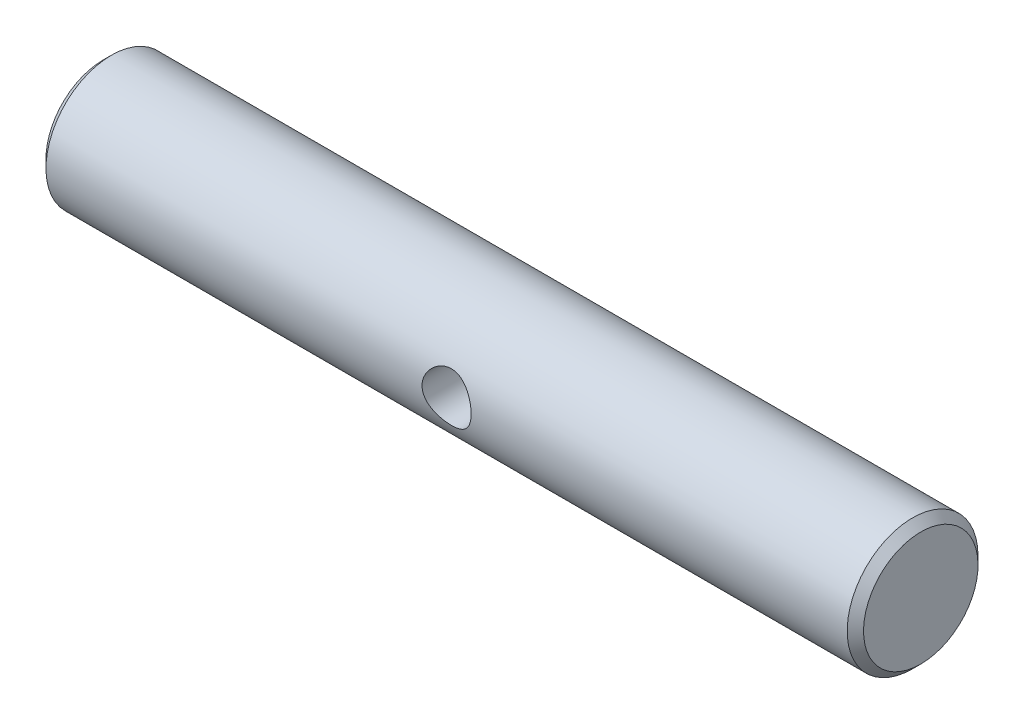
ISO-10303-21;
HEADER;
FILE_DESCRIPTION(('STEP AP214'),'2;1');
FILE_NAME('part.step','',(''),(''),'','','');
FILE_SCHEMA(('AUTOMOTIVE_DESIGN { 1 0 10303 214 1 1 1 1 }'));
ENDSEC;
DATA;
#1=APPLICATION_CONTEXT('core data for automotive mechanical design processes');
#2=APPLICATION_PROTOCOL_DEFINITION('international standard','automotive_design',2000,#1);
#3=PRODUCT_CONTEXT('',#1,'mechanical');
#4=PRODUCT('Part','Part','',(#3));
#5=PRODUCT_RELATED_PRODUCT_CATEGORY('part','',(#4));
#6=PRODUCT_DEFINITION_FORMATION('','',#4);
#7=PRODUCT_DEFINITION_CONTEXT('part definition',#1,'design');
#8=PRODUCT_DEFINITION('design','',#6,#7);
#9=PRODUCT_DEFINITION_SHAPE('','',#8);
#10=(LENGTH_UNIT() NAMED_UNIT(*) SI_UNIT(.MILLI.,.METRE.));
#11=(NAMED_UNIT(*) PLANE_ANGLE_UNIT() SI_UNIT($,.RADIAN.));
#12=(NAMED_UNIT(*) SI_UNIT($,.STERADIAN.) SOLID_ANGLE_UNIT());
#13=UNCERTAINTY_MEASURE_WITH_UNIT(LENGTH_MEASURE(1.E-05),#10,'distance_accuracy_value','');
#14=(GEOMETRIC_REPRESENTATION_CONTEXT(3) GLOBAL_UNCERTAINTY_ASSIGNED_CONTEXT((#13)) GLOBAL_UNIT_ASSIGNED_CONTEXT((#10,
#11,#12)) REPRESENTATION_CONTEXT('',''));
#15=CARTESIAN_POINT('',(0.,0.,0.));
#16=DIRECTION('',(0.,0.,1.));
#17=DIRECTION('',(1.,0.,0.));
#18=AXIS2_PLACEMENT_3D('',#15,#16,#17);
#19=CARTESIAN_POINT('',(-25.,0.,0.));
#20=DIRECTION('',(1.,0.,0.));
#21=DIRECTION('',(0.,0.,-1.));
#22=AXIS2_PLACEMENT_3D('',#19,#20,#21);
#23=PLANE('',#22);
#24=CARTESIAN_POINT('',(-24.9999999999204,0.,15.));
#25=DIRECTION('',(1.,0.,0.));
#26=DIRECTION('',(0.,1.,0.));
#27=AXIS2_PLACEMENT_3D('',#24,#25,#26);
#28=CIRCLE('',#27,3.49999999998772);
#29=CARTESIAN_POINT('',(-24.9999999999204,3.49999999998772,15.));
#30=VERTEX_POINT('',#29);
#31=EDGE_CURVE('E18',#30,#30,#28,.T.);
#32=ORIENTED_EDGE('',*,*,#31,.F.);
#33=EDGE_LOOP('',(#32));
#34=FACE_BOUND('',#33,.T.);
#35=ADVANCED_FACE('F15',(#34),#23,.F.);
#36=CARTESIAN_POINT('',(25.,0.,0.));
#37=DIRECTION('',(1.,0.,0.));
#38=DIRECTION('',(0.,0.,-1.));
#39=AXIS2_PLACEMENT_3D('',#36,#37,#38);
#40=PLANE('',#39);
#41=CARTESIAN_POINT('',(25.0000000000341,0.,15.));
#42=DIRECTION('',(-1.,0.,0.));
#43=DIRECTION('',(0.,-1.,0.));
#44=AXIS2_PLACEMENT_3D('',#41,#42,#43);
#45=CIRCLE('',#44,3.49999999996044);
#46=CARTESIAN_POINT('',(25.0000000000341,-3.49999999996044,15.));
#47=VERTEX_POINT('',#46);
#48=EDGE_CURVE('E79',#47,#47,#45,.T.);
#49=ORIENTED_EDGE('',*,*,#48,.F.);
#50=EDGE_LOOP('',(#49));
#51=FACE_BOUND('',#50,.T.);
#52=ADVANCED_FACE('F68',(#51),#40,.T.);
#53=CARTESIAN_POINT('',(-24.4999999999322,0.,15.));
#54=DIRECTION('',(1.,0.,0.));
#55=DIRECTION('',(0.,1.,0.));
#56=AXIS2_PLACEMENT_3D('',#53,#54,#55);
#57=CONICAL_SURFACE('',#56,3.9999999999759,0.785398163397448);
#58=ORIENTED_EDGE('',*,*,#31,.T.);
#59=EDGE_LOOP('',(#58));
#60=FACE_BOUND('',#59,.T.);
#61=CARTESIAN_POINT('',(-24.5,0.,15.));
#62=DIRECTION('',(1.,0.,0.));
#63=DIRECTION('',(0.,0.,-1.));
#64=AXIS2_PLACEMENT_3D('',#61,#62,#63);
#65=CIRCLE('',#64,4.);
#66=CARTESIAN_POINT('',(-24.5,0.,11.));
#67=VERTEX_POINT('',#66);
#68=EDGE_CURVE('E36',#67,#67,#65,.T.);
#69=ORIENTED_EDGE('',*,*,#68,.F.);
#70=EDGE_LOOP('',(#69));
#71=FACE_BOUND('',#70,.T.);
#72=ADVANCED_FACE('F63',(#60,#71),#57,.T.);
#73=CARTESIAN_POINT('',(24.5000000001028,0.,15.));
#74=DIRECTION('',(-1.,0.,0.));
#75=DIRECTION('',(0.,-1.,0.));
#76=AXIS2_PLACEMENT_3D('',#73,#74,#75);
#77=CONICAL_SURFACE('',#76,3.99999999989177,0.785398163397448);
#78=ORIENTED_EDGE('',*,*,#48,.T.);
#79=EDGE_LOOP('',(#78));
#80=FACE_BOUND('',#79,.T.);
#81=CARTESIAN_POINT('',(24.5,0.,15.));
#82=DIRECTION('',(1.,0.,0.));
#83=DIRECTION('',(0.,0.,-1.));
#84=AXIS2_PLACEMENT_3D('',#81,#82,#83);
#85=CIRCLE('',#84,4.);
#86=CARTESIAN_POINT('',(24.5,0.,11.));
#87=VERTEX_POINT('',#86);
#88=EDGE_CURVE('E22',#87,#87,#85,.F.);
#89=ORIENTED_EDGE('',*,*,#88,.F.);
#90=EDGE_LOOP('',(#89));
#91=FACE_BOUND('',#90,.T.);
#92=ADVANCED_FACE('F52',(#80,#91),#77,.T.);
#93=CARTESIAN_POINT('',(0.,0.,-28.5269119345812));
#94=DIRECTION('',(0.,0.,1.));
#95=DIRECTION('',(1.,0.,0.));
#96=AXIS2_PLACEMENT_3D('',#93,#94,#95);
#97=CYLINDRICAL_SURFACE('',#96,1.5);
#98=CARTESIAN_POINT('',(1.5,0.,19.));
#99=CARTESIAN_POINT('',(1.49999531099465,-0.081111642988471,18.9999964151412));
#100=CARTESIAN_POINT('',(1.49338938745138,-0.16229921963897,18.9975065011371));
#101=CARTESIAN_POINT('',(1.46720660039424,-0.322336155858778,18.987800545205));
#102=CARTESIAN_POINT('',(1.44760993379607,-0.401181753294325,18.9805772879636));
#103=CARTESIAN_POINT('',(1.39624231347491,-0.554069232231289,18.9621864368416));
#104=CARTESIAN_POINT('',(1.36450309579201,-0.628123052651569,18.9510291309837));
#105=CARTESIAN_POINT('',(1.2898799190623,-0.76982215727645,18.9258832837471));
#106=CARTESIAN_POINT('',(1.24699654962911,-0.837467780266993,18.9118948921638));
#107=CARTESIAN_POINT('',(1.14938858838142,-0.96734457210255,18.8818627952405));
#108=CARTESIAN_POINT('',(1.09427228489637,-1.02926777687364,18.865760764713));
#109=CARTESIAN_POINT('',(0.974592564626967,-1.14324188632408,18.8336029601821));
#110=CARTESIAN_POINT('',(0.910025832054865,-1.19528931119753,18.8175472044392));
#111=CARTESIAN_POINT('',(0.770282478567811,-1.28998203402363,18.7866246925215));
#112=CARTESIAN_POINT('',(0.694795528037964,-1.33219398439963,18.7718264670517));
#113=CARTESIAN_POINT('',(0.537151533998551,-1.40318650874601,18.7459985878248));
#114=CARTESIAN_POINT('',(0.454997179300717,-1.43197246582411,18.7349674241526));
#115=CARTESIAN_POINT('',(0.289883223820329,-1.4740843178649,18.7185441245557));
#116=CARTESIAN_POINT('',(0.207094888296945,-1.48799594439153,18.7129392385568));
#117=CARTESIAN_POINT('',(0.0401837675610272,-1.50179556532977,18.7073806146396));
#118=CARTESIAN_POINT('',(-0.0439384509453212,-1.50168936368421,18.7074245378876));
#119=CARTESIAN_POINT('',(-0.205769379258228,-1.48790430964632,18.7129751112928));
#120=CARTESIAN_POINT('',(-0.283560616182979,-1.47503813739896,18.7181546693363));
#121=CARTESIAN_POINT('',(-0.435786872782353,-1.43744176653922,18.7328493450566));
#122=CARTESIAN_POINT('',(-0.510221372622172,-1.4127097371985,18.7423651317386));
#123=CARTESIAN_POINT('',(-0.655278746807224,-1.35163679493086,18.764857282738));
#124=CARTESIAN_POINT('',(-0.725802721117845,-1.31508487135367,18.7778957798673));
#125=CARTESIAN_POINT('',(-0.859948672521441,-1.23155851162953,18.8059427916407));
#126=CARTESIAN_POINT('',(-0.923568573944547,-1.18458095393025,18.8209518957561));
#127=CARTESIAN_POINT('',(-1.04659388295345,-1.07782653131746,18.8524778893326));
#128=CARTESIAN_POINT('',(-1.10543046100101,-1.01740255191559,18.8690283901562));
#129=CARTESIAN_POINT('',(-1.21232323409957,-0.887333075094534,18.9009125484397));
#130=CARTESIAN_POINT('',(-1.26037445221371,-0.817683343900649,18.9162456420228));
#131=CARTESIAN_POINT('',(-1.34496404362537,-0.669667722666034,18.9442752164331));
#132=CARTESIAN_POINT('',(-1.38130440400476,-0.591179456886812,18.9569252251831));
#133=CARTESIAN_POINT('',(-1.44001960464153,-0.428688642380452,18.977800303447));
#134=CARTESIAN_POINT('',(-1.46242269657434,-0.344697632799011,18.9860343197348));
#135=CARTESIAN_POINT('',(-1.48491866803032,-0.216582758497681,18.9943639258091));
#136=CARTESIAN_POINT('',(-1.49056593106552,-0.173494852533975,18.9964702826107));
#137=CARTESIAN_POINT('',(-1.49810784826254,-0.086945238012849,18.9992892785148));
#138=CARTESIAN_POINT('',(-1.50000251375142,-0.0434835305841308,19.0000019218242));
#139=CARTESIAN_POINT('',(-1.49999531099465,0.0811116429884713,18.9999964151412));
#140=CARTESIAN_POINT('',(-1.49338938745138,0.16229921963897,18.9975065011371));
#141=CARTESIAN_POINT('',(-1.46720660039424,0.322336155858779,18.987800545205));
#142=CARTESIAN_POINT('',(-1.44760993379607,0.401181753294325,18.9805772879636));
#143=CARTESIAN_POINT('',(-1.39624231347491,0.554069232231289,18.9621864368416));
#144=CARTESIAN_POINT('',(-1.36450309579201,0.628123052651569,18.9510291309837));
#145=CARTESIAN_POINT('',(-1.2898799190623,0.76982215727645,18.9258832837471));
#146=CARTESIAN_POINT('',(-1.24699654962911,0.837467780266993,18.9118948921638));
#147=CARTESIAN_POINT('',(-1.14938858838142,0.96734457210255,18.8818627952405));
#148=CARTESIAN_POINT('',(-1.09427228489637,1.02926777687364,18.865760764713));
#149=CARTESIAN_POINT('',(-0.974592564626967,1.14324188632408,18.8336029601821));
#150=CARTESIAN_POINT('',(-0.910025832054865,1.19528931119753,18.8175472044392));
#151=CARTESIAN_POINT('',(-0.770282478567812,1.28998203402363,18.7866246925215));
#152=CARTESIAN_POINT('',(-0.694795528037965,1.33219398439963,18.7718264670517));
#153=CARTESIAN_POINT('',(-0.537151533998552,1.40318650874601,18.7459985878248));
#154=CARTESIAN_POINT('',(-0.454997179300718,1.43197246582411,18.7349674241526));
#155=CARTESIAN_POINT('',(-0.289883223820329,1.4740843178649,18.7185441245557));
#156=CARTESIAN_POINT('',(-0.207094888296945,1.48799594439153,18.7129392385568));
#157=CARTESIAN_POINT('',(-0.0401837675610266,1.50179556532977,18.7073806146396));
#158=CARTESIAN_POINT('',(0.0439384509453218,1.50168936368421,18.7074245378876));
#159=CARTESIAN_POINT('',(0.205769379258228,1.48790430964632,18.7129751112928));
#160=CARTESIAN_POINT('',(0.283560616182979,1.47503813739896,18.7181546693363));
#161=CARTESIAN_POINT('',(0.435786872782354,1.43744176653922,18.7328493450565));
#162=CARTESIAN_POINT('',(0.510221372622173,1.4127097371985,18.7423651317386));
#163=CARTESIAN_POINT('',(0.655278746807224,1.35163679493086,18.764857282738));
#164=CARTESIAN_POINT('',(0.725802721117845,1.31508487135368,18.7778957798673));
#165=CARTESIAN_POINT('',(0.85994867252144,1.23155851162953,18.8059427916407));
#166=CARTESIAN_POINT('',(0.923568573944546,1.18458095393025,18.8209518957561));
#167=CARTESIAN_POINT('',(1.04659388295345,1.07782653131746,18.8524778893326));
#168=CARTESIAN_POINT('',(1.10543046100101,1.01740255191559,18.8690283901562));
#169=CARTESIAN_POINT('',(1.21232323409957,0.887333075094535,18.9009125484397));
#170=CARTESIAN_POINT('',(1.26037445221371,0.817683343900649,18.9162456420228));
#171=CARTESIAN_POINT('',(1.34496404362537,0.669667722666033,18.9442752164331));
#172=CARTESIAN_POINT('',(1.38130440400476,0.591179456886811,18.9569252251831));
#173=CARTESIAN_POINT('',(1.44001960464153,0.428688642380452,18.977800303447));
#174=CARTESIAN_POINT('',(1.46242269657434,0.344697632799011,18.9860343197348));
#175=CARTESIAN_POINT('',(1.48491866803032,0.216582758497681,18.9943639258091));
#176=CARTESIAN_POINT('',(1.49056593106552,0.173494852533975,18.9964702826107));
#177=CARTESIAN_POINT('',(1.49810784826254,0.0869452380128492,18.9992892785148));
#178=CARTESIAN_POINT('',(1.50000251375142,0.0434835305841311,19.0000019218242));
#179=CARTESIAN_POINT('',(1.5,0.,19.));
#180=B_SPLINE_CURVE_WITH_KNOTS('',3,(#98,#99,#100,#101,#102,#103,#104,#105,#106,#107,#108,#109,
#110,#111,#112,#113,#114,#115,#116,#117,#118,#119,#120,#121,#122,#123,#124,#125,#126,#127,#128,
#129,#130,#131,#132,#133,#134,#135,#136,#137,#138,#139,#140,#141,#142,#143,#144,#145,#146,#147,
#148,#149,#150,#151,#152,#153,#154,#155,#156,#157,#158,#159,#160,#161,#162,#163,#164,#165,#166,
#167,#168,#169,#170,#171,#172,#173,#174,#175,#176,#177,#178,#179),.UNSPECIFIED.,.T.,.F.,(4,2,2,
2,2,2,2,2,2,2,2,2,2,2,2,2,2,2,2,2,2,2,2,2,2,2,2,2,2,2,2,2,2,2,2,2,2,2,2,2,4),(0.,
0.243166514302296,0.486704566599219,0.729610403544445,0.972503391468791,1.22473037141675,
1.47704606108122,1.73896693662271,2.00078270538428,2.25185886666104,2.50283107266743,
2.73878302477871,2.97477139254032,3.21522960902626,3.45575991877768,3.71242215551977,
3.96920258743901,4.23012113132895,4.49050903953852,4.62086973855367,4.75123004407976,
4.99439655838206,5.23793461067898,5.48084044762421,5.72373343554855,5.97596041549652,
6.22827610516098,6.49019698070247,6.75201274946405,7.0030889107408,7.25406111674719,
7.49001306885847,7.72600143662008,7.96645965310602,8.20698996285745,8.46365219959953,
8.72043263151877,8.98135117540872,9.24173908361828,9.37209978263343,9.50246008815952),.UNSPECIFIED.);
#181=CARTESIAN_POINT('',(1.5,0.,19.));
#182=VERTEX_POINT('',#181);
#183=EDGE_CURVE('E10',#182,#182,#180,.T.);
#184=ORIENTED_EDGE('',*,*,#183,.F.);
#185=EDGE_LOOP('',(#184));
#186=FACE_BOUND('',#185,.T.);
#187=CARTESIAN_POINT('',(-1.5,0.,11.));
#188=CARTESIAN_POINT('',(-1.49999531099465,-0.0811116429884721,11.0000035848588));
#189=CARTESIAN_POINT('',(-1.49338938745138,-0.162299219638971,11.0024934988629));
#190=CARTESIAN_POINT('',(-1.46720660039424,-0.32233615585878,11.012199454795));
#191=CARTESIAN_POINT('',(-1.44760993379607,-0.401181753294326,11.0194227120364));
#192=CARTESIAN_POINT('',(-1.39624231347491,-0.55406923223129,11.0378135631584));
#193=CARTESIAN_POINT('',(-1.36450309579201,-0.62812305265157,11.0489708690163));
#194=CARTESIAN_POINT('',(-1.2898799190623,-0.76982215727645,11.0741167162529));
#195=CARTESIAN_POINT('',(-1.2469965496291,-0.837467780266993,11.0881051078361));
#196=CARTESIAN_POINT('',(-1.14938858838142,-0.96734457210255,11.1181372047595));
#197=CARTESIAN_POINT('',(-1.09427228489637,-1.02926777687364,11.134239235287));
#198=CARTESIAN_POINT('',(-0.974592564626967,-1.14324188632408,11.1663970398179));
#199=CARTESIAN_POINT('',(-0.910025832054865,-1.19528931119753,11.1824527955608));
#200=CARTESIAN_POINT('',(-0.770282478567811,-1.28998203402363,11.2133753074785));
#201=CARTESIAN_POINT('',(-0.694795528037963,-1.33219398439963,11.2281735329483));
#202=CARTESIAN_POINT('',(-0.537151533998551,-1.40318650874601,11.2540014121752));
#203=CARTESIAN_POINT('',(-0.454997179300717,-1.43197246582411,11.2650325758474));
#204=CARTESIAN_POINT('',(-0.289883223820329,-1.4740843178649,11.2814558754443));
#205=CARTESIAN_POINT('',(-0.207094888296945,-1.48799594439153,11.2870607614432));
#206=CARTESIAN_POINT('',(-0.0401837675610272,-1.50179556532977,11.2926193853604));
#207=CARTESIAN_POINT('',(0.0439384509453212,-1.50168936368421,11.2925754621124));
#208=CARTESIAN_POINT('',(0.205769379258228,-1.48790430964632,11.2870248887072));
#209=CARTESIAN_POINT('',(0.283560616182979,-1.47503813739896,11.2818453306637));
#210=CARTESIAN_POINT('',(0.435786872782353,-1.43744176653922,11.2671506549435));
#211=CARTESIAN_POINT('',(0.510221372622172,-1.4127097371985,11.2576348682614));
#212=CARTESIAN_POINT('',(0.655278746807223,-1.35163679493086,11.235142717262));
#213=CARTESIAN_POINT('',(0.725802721117845,-1.31508487135368,11.2221042201327));
#214=CARTESIAN_POINT('',(0.85994867252144,-1.23155851162953,11.1940572083593));
#215=CARTESIAN_POINT('',(0.923568573944546,-1.18458095393025,11.1790481042439));
#216=CARTESIAN_POINT('',(1.04659388295345,-1.07782653131746,11.1475221106674));
#217=CARTESIAN_POINT('',(1.10543046100101,-1.01740255191559,11.1309716098437));
#218=CARTESIAN_POINT('',(1.21232323409957,-0.887333075094535,11.0990874515603));
#219=CARTESIAN_POINT('',(1.26037445221371,-0.817683343900649,11.0837543579772));
#220=CARTESIAN_POINT('',(1.34496404362537,-0.669667722666033,11.0557247835669));
#221=CARTESIAN_POINT('',(1.38130440400476,-0.591179456886811,11.0430747748169));
#222=CARTESIAN_POINT('',(1.44001960464153,-0.428688642380452,11.022199696553));
#223=CARTESIAN_POINT('',(1.46242269657435,-0.34469763279901,11.0139656802652));
#224=CARTESIAN_POINT('',(1.48491866803032,-0.216582758497681,11.0056360741909));
#225=CARTESIAN_POINT('',(1.49056593106552,-0.173494852533975,11.0035297173893));
#226=CARTESIAN_POINT('',(1.49810784826254,-0.0869452380128499,11.0007107214852));
#227=CARTESIAN_POINT('',(1.50000251375142,-0.043483530584132,10.9999980781758));
#228=CARTESIAN_POINT('',(1.49999531099465,0.0811116429884697,11.0000035848588));
#229=CARTESIAN_POINT('',(1.49338938745138,0.162299219638968,11.0024934988629));
#230=CARTESIAN_POINT('',(1.46720660039425,0.322336155858777,11.012199454795));
#231=CARTESIAN_POINT('',(1.44760993379608,0.401181753294324,11.0194227120364));
#232=CARTESIAN_POINT('',(1.39624231347491,0.554069232231287,11.0378135631584));
#233=CARTESIAN_POINT('',(1.36450309579201,0.628123052651567,11.0489708690163));
#234=CARTESIAN_POINT('',(1.28987991906231,0.769822157276448,11.0741167162529));
#235=CARTESIAN_POINT('',(1.24699654962911,0.837467780266991,11.0881051078362));
#236=CARTESIAN_POINT('',(1.14938858838142,0.967344572102548,11.1181372047595));
#237=CARTESIAN_POINT('',(1.09427228489637,1.02926777687364,11.134239235287));
#238=CARTESIAN_POINT('',(0.974592564626968,1.14324188632408,11.1663970398179));
#239=CARTESIAN_POINT('',(0.910025832054866,1.19528931119753,11.1824527955608));
#240=CARTESIAN_POINT('',(0.770282478567813,1.28998203402363,11.2133753074785));
#241=CARTESIAN_POINT('',(0.694795528037965,1.33219398439963,11.2281735329483));
#242=CARTESIAN_POINT('',(0.537151533998553,1.40318650874601,11.2540014121752));
#243=CARTESIAN_POINT('',(0.454997179300719,1.43197246582411,11.2650325758474));
#244=CARTESIAN_POINT('',(0.289883223820331,1.4740843178649,11.2814558754443));
#245=CARTESIAN_POINT('',(0.207094888296947,1.48799594439153,11.2870607614432));
#246=CARTESIAN_POINT('',(0.0401837675610291,1.50179556532977,11.2926193853604));
#247=CARTESIAN_POINT('',(-0.0439384509453192,1.50168936368421,11.2925754621124));
#248=CARTESIAN_POINT('',(-0.205769379258226,1.48790430964632,11.2870248887072));
#249=CARTESIAN_POINT('',(-0.283560616182977,1.47503813739896,11.2818453306637));
#250=CARTESIAN_POINT('',(-0.435786872782351,1.43744176653922,11.2671506549435));
#251=CARTESIAN_POINT('',(-0.51022137262217,1.4127097371985,11.2576348682614));
#252=CARTESIAN_POINT('',(-0.655278746807222,1.35163679493087,11.235142717262));
#253=CARTESIAN_POINT('',(-0.725802721117843,1.31508487135368,11.2221042201327));
#254=CARTESIAN_POINT('',(-0.859948672521438,1.23155851162953,11.1940572083593));
#255=CARTESIAN_POINT('',(-0.923568573944545,1.18458095393025,11.1790481042439));
#256=CARTESIAN_POINT('',(-1.04659388295345,1.07782653131746,11.1475221106674));
#257=CARTESIAN_POINT('',(-1.10543046100101,1.01740255191559,11.1309716098438));
#258=CARTESIAN_POINT('',(-1.21232323409956,0.887333075094537,11.0990874515603));
#259=CARTESIAN_POINT('',(-1.26037445221371,0.817683343900651,11.0837543579772));
#260=CARTESIAN_POINT('',(-1.34496404362537,0.669667722666035,11.0557247835669));
#261=CARTESIAN_POINT('',(-1.38130440400476,0.591179456886813,11.0430747748169));
#262=CARTESIAN_POINT('',(-1.44001960464153,0.428688642380454,11.022199696553));
#263=CARTESIAN_POINT('',(-1.46242269657434,0.344697632799012,11.0139656802652));
#264=CARTESIAN_POINT('',(-1.48491866803032,0.216582758497682,11.0056360741909));
#265=CARTESIAN_POINT('',(-1.49056593106552,0.173494852533976,11.0035297173893));
#266=CARTESIAN_POINT('',(-1.49810784826254,0.0869452380128493,11.0007107214852));
#267=CARTESIAN_POINT('',(-1.50000251375142,0.0434835305841305,10.9999980781758));
#268=CARTESIAN_POINT('',(-1.5,0.,11.));
#269=B_SPLINE_CURVE_WITH_KNOTS('',3,(#187,#188,#189,#190,#191,#192,#193,#194,#195,#196,#197,
#198,#199,#200,#201,#202,#203,#204,#205,#206,#207,#208,#209,#210,#211,#212,#213,#214,#215,#216,
#217,#218,#219,#220,#221,#222,#223,#224,#225,#226,#227,#228,#229,#230,#231,#232,#233,#234,#235,
#236,#237,#238,#239,#240,#241,#242,#243,#244,#245,#246,#247,#248,#249,#250,#251,#252,#253,#254,
#255,#256,#257,#258,#259,#260,#261,#262,#263,#264,#265,#266,#267,#268),.UNSPECIFIED.,.T.,.F.,(4,
2,2,2,2,2,2,2,2,2,2,2,2,2,2,2,2,2,2,2,2,2,2,2,2,2,2,2,2,2,2,2,2,2,2,2,2,2,2,2,4),(0.,
0.243166514302296,0.486704566599218,0.729610403544444,0.97250339146879,1.22473037141675,
1.47704606108122,1.73896693662271,2.00078270538428,2.25185886666104,2.50283107266743,
2.73878302477871,2.97477139254032,3.21522960902625,3.45575991877768,3.71242215551977,
3.96920258743901,4.23012113132895,4.49050903953852,4.62086973855367,4.75123004407976,
4.99439655838206,5.23793461067898,5.4808404476242,5.72373343554855,5.97596041549651,
6.22827610516098,6.49019698070247,6.75201274946404,7.0030889107408,7.25406111674719,
7.49001306885847,7.72600143662008,7.96645965310601,8.20698996285744,8.46365219959953,
8.72043263151877,8.98135117540871,9.24173908361828,9.37209978263343,9.50246008815953),.UNSPECIFIED.);
#270=CARTESIAN_POINT('',(-1.5,0.,11.));
#271=VERTEX_POINT('',#270);
#272=EDGE_CURVE('E27',#271,#271,#269,.T.);
#273=ORIENTED_EDGE('',*,*,#272,.F.);
#274=EDGE_LOOP('',(#273));
#275=FACE_BOUND('',#274,.T.);
#276=ADVANCED_FACE('F40',(#186,#275),#97,.F.);
#277=CARTESIAN_POINT('',(-25.,0.,15.));
#278=DIRECTION('',(1.,0.,0.));
#279=DIRECTION('',(0.,0.,-1.));
#280=AXIS2_PLACEMENT_3D('',#277,#278,#279);
#281=CYLINDRICAL_SURFACE('',#280,4.);
#282=ORIENTED_EDGE('',*,*,#68,.T.);
#283=EDGE_LOOP('',(#282));
#284=FACE_BOUND('',#283,.T.);
#285=ORIENTED_EDGE('',*,*,#272,.T.);
#286=EDGE_LOOP('',(#285));
#287=FACE_BOUND('',#286,.T.);
#288=ORIENTED_EDGE('',*,*,#88,.T.);
#289=EDGE_LOOP('',(#288));
#290=FACE_BOUND('',#289,.T.);
#291=ORIENTED_EDGE('',*,*,#183,.T.);
#292=EDGE_LOOP('',(#291));
#293=FACE_BOUND('',#292,.T.);
#294=ADVANCED_FACE('F43',(#284,#287,#290,#293),#281,.T.);
#295=CLOSED_SHELL('',(#35,#52,#72,#92,#276,#294));
#296=MANIFOLD_SOLID_BREP('B1',#295);
#297=ADVANCED_BREP_SHAPE_REPRESENTATION('',(#18,#296),#14);
#298=SHAPE_DEFINITION_REPRESENTATION(#9,#297);
ENDSEC;
END-ISO-10303-21;
